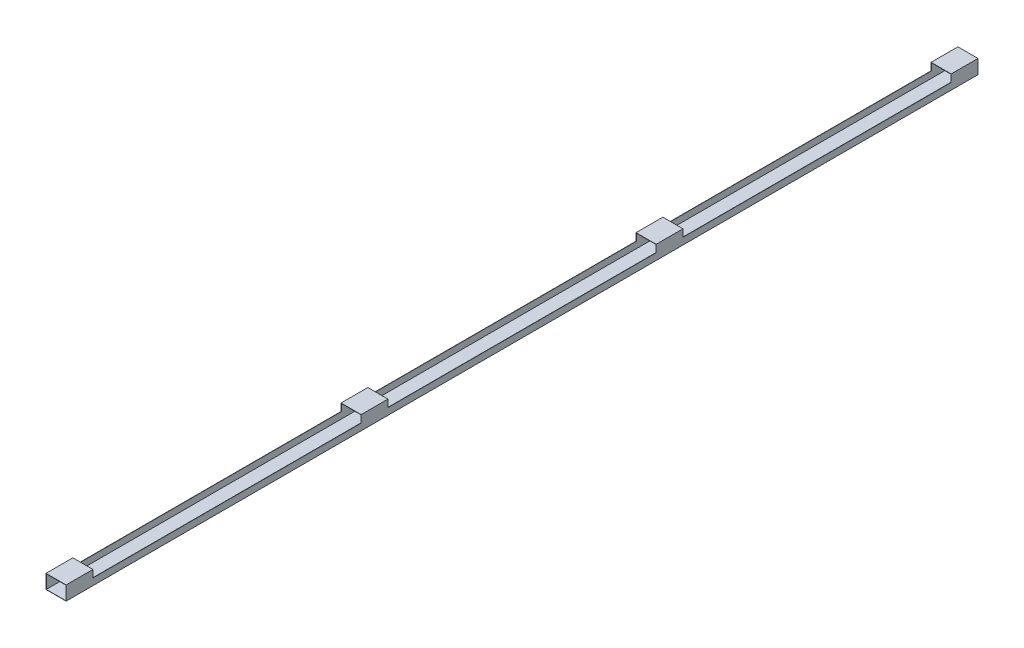
ISO-10303-21;
HEADER;
FILE_DESCRIPTION(('STEP AP214'),'2;1');
FILE_NAME('part.step','',(''),(''),'','','');
FILE_SCHEMA(('AUTOMOTIVE_DESIGN { 1 0 10303 214 1 1 1 1 }'));
ENDSEC;
DATA;
#1=APPLICATION_CONTEXT('core data for automotive mechanical design processes');
#2=APPLICATION_PROTOCOL_DEFINITION('international standard','automotive_design',2000,#1);
#3=PRODUCT_CONTEXT('',#1,'mechanical');
#4=PRODUCT('Part','Part','',(#3));
#5=PRODUCT_RELATED_PRODUCT_CATEGORY('part','',(#4));
#6=PRODUCT_DEFINITION_FORMATION('','',#4);
#7=PRODUCT_DEFINITION_CONTEXT('part definition',#1,'design');
#8=PRODUCT_DEFINITION('design','',#6,#7);
#9=PRODUCT_DEFINITION_SHAPE('','',#8);
#10=(LENGTH_UNIT() NAMED_UNIT(*) SI_UNIT(.MILLI.,.METRE.));
#11=(NAMED_UNIT(*) PLANE_ANGLE_UNIT() SI_UNIT($,.RADIAN.));
#12=(NAMED_UNIT(*) SI_UNIT($,.STERADIAN.) SOLID_ANGLE_UNIT());
#13=UNCERTAINTY_MEASURE_WITH_UNIT(LENGTH_MEASURE(1.E-05),#10,'distance_accuracy_value','');
#14=(GEOMETRIC_REPRESENTATION_CONTEXT(3) GLOBAL_UNCERTAINTY_ASSIGNED_CONTEXT((#13)) GLOBAL_UNIT_ASSIGNED_CONTEXT((#10,
#11,#12)) REPRESENTATION_CONTEXT('',''));
#15=CARTESIAN_POINT('',(0.,0.,0.));
#16=DIRECTION('',(0.,0.,1.));
#17=DIRECTION('',(1.,0.,0.));
#18=AXIS2_PLACEMENT_3D('',#15,#16,#17);
#19=CARTESIAN_POINT('',(-75.,25.,3400.));
#20=DIRECTION('',(0.,-1.,0.));
#21=DIRECTION('',(0.,0.,-1.));
#22=AXIS2_PLACEMENT_3D('',#19,#20,#21);
#23=PLANE('',#22);
#24=DIRECTION('',(0.,0.,-1.));
#25=VECTOR('',#24,1.);
#26=CARTESIAN_POINT('',(73.,25.,3400.));
#27=LINE('',#26,#25);
#28=CARTESIAN_POINT('',(73.,25.,3200.));
#29=VERTEX_POINT('',#28);
#30=CARTESIAN_POINT('',(73.,25.,1200.));
#31=VERTEX_POINT('',#30);
#32=EDGE_CURVE('E306',#29,#31,#27,.T.);
#33=ORIENTED_EDGE('',*,*,#32,.F.);
#34=DIRECTION('',(-1.,0.,0.));
#35=VECTOR('',#34,1.);
#36=CARTESIAN_POINT('',(-75.,25.,3200.));
#37=LINE('',#36,#35);
#38=CARTESIAN_POINT('',(75.,25.,3200.));
#39=VERTEX_POINT('',#38);
#40=EDGE_CURVE('E392',#39,#29,#37,.T.);
#41=ORIENTED_EDGE('',*,*,#40,.F.);
#42=DIRECTION('',(0.,0.,-1.));
#43=VECTOR('',#42,1.);
#44=CARTESIAN_POINT('',(75.,25.,3400.));
#45=LINE('',#44,#43);
#46=CARTESIAN_POINT('',(75.,25.,1200.));
#47=VERTEX_POINT('',#46);
#48=EDGE_CURVE('E11',#39,#47,#45,.T.);
#49=ORIENTED_EDGE('',*,*,#48,.T.);
#50=DIRECTION('',(1.,0.,0.));
#51=VECTOR('',#50,1.);
#52=CARTESIAN_POINT('',(-75.,25.,1200.));
#53=LINE('',#52,#51);
#54=EDGE_CURVE('E326',#31,#47,#53,.T.);
#55=ORIENTED_EDGE('',*,*,#54,.F.);
#56=EDGE_LOOP('',(#33,#41,#49,#55));
#57=FACE_BOUND('',#56,.T.);
#58=ADVANCED_FACE('F17',(#57),#23,.F.);
#59=DIRECTION('',(0.,0.,-1.));
#60=VECTOR('',#59,1.);
#61=CARTESIAN_POINT('',(73.,25.,3400.));
#62=LINE('',#61,#60);
#63=CARTESIAN_POINT('',(73.,25.,1000.));
#64=VERTEX_POINT('',#63);
#65=CARTESIAN_POINT('',(73.,25.,-1000.));
#66=VERTEX_POINT('',#65);
#67=EDGE_CURVE('E282',#64,#66,#62,.T.);
#68=ORIENTED_EDGE('',*,*,#67,.F.);
#69=DIRECTION('',(-1.,0.,0.));
#70=VECTOR('',#69,1.);
#71=CARTESIAN_POINT('',(-75.,25.,1000.));
#72=LINE('',#71,#70);
#73=CARTESIAN_POINT('',(75.,25.,1000.));
#74=VERTEX_POINT('',#73);
#75=EDGE_CURVE('E337',#74,#64,#72,.T.);
#76=ORIENTED_EDGE('',*,*,#75,.F.);
#77=CARTESIAN_POINT('',(75.,25.,-1000.));
#78=VERTEX_POINT('',#77);
#79=EDGE_CURVE('E27',#74,#78,#45,.T.);
#80=ORIENTED_EDGE('',*,*,#79,.T.);
#81=DIRECTION('',(1.,0.,0.));
#82=VECTOR('',#81,1.);
#83=CARTESIAN_POINT('',(-75.,25.,-1000.));
#84=LINE('',#83,#82);
#85=EDGE_CURVE('E359',#66,#78,#84,.T.);
#86=ORIENTED_EDGE('',*,*,#85,.F.);
#87=EDGE_LOOP('',(#68,#76,#80,#86));
#88=FACE_BOUND('',#87,.T.);
#89=ADVANCED_FACE('F460',(#88),#23,.F.);
#90=DIRECTION('',(0.,0.,-1.));
#91=VECTOR('',#90,1.);
#92=CARTESIAN_POINT('',(73.,25.,3400.));
#93=LINE('',#92,#91);
#94=CARTESIAN_POINT('',(73.,25.,-1200.));
#95=VERTEX_POINT('',#94);
#96=CARTESIAN_POINT('',(73.,25.,-3200.));
#97=VERTEX_POINT('',#96);
#98=EDGE_CURVE('E280',#95,#97,#93,.T.);
#99=ORIENTED_EDGE('',*,*,#98,.F.);
#100=DIRECTION('',(-1.,0.,0.));
#101=VECTOR('',#100,1.);
#102=CARTESIAN_POINT('',(-75.,25.,-1200.));
#103=LINE('',#102,#101);
#104=CARTESIAN_POINT('',(75.,25.,-1200.));
#105=VERTEX_POINT('',#104);
#106=EDGE_CURVE('E364',#105,#95,#103,.T.);
#107=ORIENTED_EDGE('',*,*,#106,.F.);
#108=CARTESIAN_POINT('',(75.,25.,-3200.));
#109=VERTEX_POINT('',#108);
#110=EDGE_CURVE('E441',#105,#109,#45,.T.);
#111=ORIENTED_EDGE('',*,*,#110,.T.);
#112=DIRECTION('',(1.,0.,0.));
#113=VECTOR('',#112,1.);
#114=CARTESIAN_POINT('',(-75.,25.,-3200.));
#115=LINE('',#114,#113);
#116=EDGE_CURVE('E21',#97,#109,#115,.T.);
#117=ORIENTED_EDGE('',*,*,#116,.F.);
#118=EDGE_LOOP('',(#99,#107,#111,#117));
#119=FACE_BOUND('',#118,.T.);
#120=ADVANCED_FACE('F504',(#119),#23,.F.);
#121=CARTESIAN_POINT('',(0.,0.,3400.));
#122=DIRECTION('',(0.,0.,-1.));
#123=DIRECTION('',(-1.,0.,0.));
#124=AXIS2_PLACEMENT_3D('',#121,#122,#123);
#125=PLANE('',#124);
#126=DIRECTION('',(0.,1.,0.));
#127=VECTOR('',#126,1.);
#128=CARTESIAN_POINT('',(75.,-25.,3400.));
#129=LINE('',#128,#127);
#130=CARTESIAN_POINT('',(75.,-25.,3400.));
#131=VERTEX_POINT('',#130);
#132=CARTESIAN_POINT('',(75.,80.,3400.));
#133=VERTEX_POINT('',#132);
#134=EDGE_CURVE('E420',#131,#133,#129,.T.);
#135=ORIENTED_EDGE('',*,*,#134,.T.);
#136=DIRECTION('',(1.,0.,0.));
#137=VECTOR('',#136,1.);
#138=CARTESIAN_POINT('',(-75.,80.,3400.));
#139=LINE('',#138,#137);
#140=CARTESIAN_POINT('',(-75.,80.,3400.));
#141=VERTEX_POINT('',#140);
#142=EDGE_CURVE('E391',#141,#133,#139,.T.);
#143=ORIENTED_EDGE('',*,*,#142,.F.);
#144=DIRECTION('',(0.,-1.,0.));
#145=VECTOR('',#144,1.);
#146=CARTESIAN_POINT('',(-75.,-25.,3400.));
#147=LINE('',#146,#145);
#148=CARTESIAN_POINT('',(-75.,-25.,3400.));
#149=VERTEX_POINT('',#148);
#150=EDGE_CURVE('E780',#141,#149,#147,.T.);
#151=ORIENTED_EDGE('',*,*,#150,.T.);
#152=DIRECTION('',(1.,0.,0.));
#153=VECTOR('',#152,1.);
#154=CARTESIAN_POINT('',(-75.,-25.,3400.));
#155=LINE('',#154,#153);
#156=EDGE_CURVE('E810',#149,#131,#155,.T.);
#157=ORIENTED_EDGE('',*,*,#156,.T.);
#158=EDGE_LOOP('',(#135,#143,#151,#157));
#159=FACE_BOUND('',#158,.T.);
#160=DIRECTION('',(0.,1.,0.));
#161=VECTOR('',#160,1.);
#162=CARTESIAN_POINT('',(73.,0.,3400.));
#163=LINE('',#162,#161);
#164=CARTESIAN_POINT('',(73.,-23.,3400.));
#165=VERTEX_POINT('',#164);
#166=CARTESIAN_POINT('',(73.,78.,3400.));
#167=VERTEX_POINT('',#166);
#168=EDGE_CURVE('E250',#165,#167,#163,.T.);
#169=ORIENTED_EDGE('',*,*,#168,.F.);
#170=DIRECTION('',(1.,0.,0.));
#171=VECTOR('',#170,1.);
#172=CARTESIAN_POINT('',(0.,-23.,3400.));
#173=LINE('',#172,#171);
#174=CARTESIAN_POINT('',(-73.,-23.,3400.));
#175=VERTEX_POINT('',#174);
#176=EDGE_CURVE('E235',#175,#165,#173,.T.);
#177=ORIENTED_EDGE('',*,*,#176,.F.);
#178=DIRECTION('',(0.,-1.,0.));
#179=VECTOR('',#178,1.);
#180=CARTESIAN_POINT('',(-73.,0.,3400.));
#181=LINE('',#180,#179);
#182=CARTESIAN_POINT('',(-73.,78.,3400.));
#183=VERTEX_POINT('',#182);
#184=EDGE_CURVE('E252',#183,#175,#181,.T.);
#185=ORIENTED_EDGE('',*,*,#184,.F.);
#186=DIRECTION('',(1.,0.,0.));
#187=VECTOR('',#186,1.);
#188=CARTESIAN_POINT('',(0.,78.,3400.));
#189=LINE('',#188,#187);
#190=EDGE_CURVE('E328',#183,#167,#189,.T.);
#191=ORIENTED_EDGE('',*,*,#190,.T.);
#192=EDGE_LOOP('',(#169,#177,#185,#191));
#193=FACE_BOUND('',#192,.T.);
#194=ADVANCED_FACE('F539',(#159,#193),#125,.F.);
#195=CARTESIAN_POINT('',(0.,0.,-3400.));
#196=DIRECTION('',(0.,0.,-1.));
#197=DIRECTION('',(-1.,0.,0.));
#198=AXIS2_PLACEMENT_3D('',#195,#196,#197);
#199=PLANE('',#198);
#200=DIRECTION('',(0.,1.,0.));
#201=VECTOR('',#200,1.);
#202=CARTESIAN_POINT('',(75.,-25.,-3400.));
#203=LINE('',#202,#201);
#204=CARTESIAN_POINT('',(75.,-25.,-3400.));
#205=VERTEX_POINT('',#204);
#206=CARTESIAN_POINT('',(75.,80.,-3400.));
#207=VERTEX_POINT('',#206);
#208=EDGE_CURVE('E436',#205,#207,#203,.T.);
#209=ORIENTED_EDGE('',*,*,#208,.F.);
#210=DIRECTION('',(1.,0.,0.));
#211=VECTOR('',#210,1.);
#212=CARTESIAN_POINT('',(-75.,-25.,-3400.));
#213=LINE('',#212,#211);
#214=CARTESIAN_POINT('',(-75.,-25.,-3400.));
#215=VERTEX_POINT('',#214);
#216=EDGE_CURVE('E803',#215,#205,#213,.T.);
#217=ORIENTED_EDGE('',*,*,#216,.F.);
#218=DIRECTION('',(0.,-1.,0.));
#219=VECTOR('',#218,1.);
#220=CARTESIAN_POINT('',(-75.,-25.,-3400.));
#221=LINE('',#220,#219);
#222=CARTESIAN_POINT('',(-75.,80.,-3400.));
#223=VERTEX_POINT('',#222);
#224=EDGE_CURVE('E802',#223,#215,#221,.T.);
#225=ORIENTED_EDGE('',*,*,#224,.F.);
#226=DIRECTION('',(-1.,0.,0.));
#227=VECTOR('',#226,1.);
#228=CARTESIAN_POINT('',(-75.,80.,-3400.));
#229=LINE('',#228,#227);
#230=EDGE_CURVE('E415',#207,#223,#229,.T.);
#231=ORIENTED_EDGE('',*,*,#230,.F.);
#232=EDGE_LOOP('',(#209,#217,#225,#231));
#233=FACE_BOUND('',#232,.T.);
#234=DIRECTION('',(1.,0.,0.));
#235=VECTOR('',#234,1.);
#236=CARTESIAN_POINT('',(0.,-23.,-3400.));
#237=LINE('',#236,#235);
#238=CARTESIAN_POINT('',(-73.,-23.,-3400.));
#239=VERTEX_POINT('',#238);
#240=CARTESIAN_POINT('',(73.,-23.,-3400.));
#241=VERTEX_POINT('',#240);
#242=EDGE_CURVE('E232',#239,#241,#237,.T.);
#243=ORIENTED_EDGE('',*,*,#242,.T.);
#244=DIRECTION('',(0.,1.,0.));
#245=VECTOR('',#244,1.);
#246=CARTESIAN_POINT('',(73.,0.,-3400.));
#247=LINE('',#246,#245);
#248=CARTESIAN_POINT('',(73.,78.,-3400.));
#249=VERTEX_POINT('',#248);
#250=EDGE_CURVE('E240',#241,#249,#247,.T.);
#251=ORIENTED_EDGE('',*,*,#250,.T.);
#252=DIRECTION('',(-1.,0.,0.));
#253=VECTOR('',#252,1.);
#254=CARTESIAN_POINT('',(0.,78.,-3400.));
#255=LINE('',#254,#253);
#256=CARTESIAN_POINT('',(-73.,78.,-3400.));
#257=VERTEX_POINT('',#256);
#258=EDGE_CURVE('E257',#249,#257,#255,.T.);
#259=ORIENTED_EDGE('',*,*,#258,.T.);
#260=DIRECTION('',(0.,-1.,0.));
#261=VECTOR('',#260,1.);
#262=CARTESIAN_POINT('',(-73.,0.,-3400.));
#263=LINE('',#262,#261);
#264=EDGE_CURVE('E246',#257,#239,#263,.T.);
#265=ORIENTED_EDGE('',*,*,#264,.T.);
#266=EDGE_LOOP('',(#243,#251,#259,#265));
#267=FACE_BOUND('',#266,.T.);
#268=ADVANCED_FACE('F249',(#233,#267),#199,.T.);
#269=CARTESIAN_POINT('',(-73.,25.,3200.));
#270=VERTEX_POINT('',#269);
#271=CARTESIAN_POINT('',(-75.,25.,3200.));
#272=VERTEX_POINT('',#271);
#273=EDGE_CURVE('E387',#270,#272,#37,.T.);
#274=ORIENTED_EDGE('',*,*,#273,.F.);
#275=DIRECTION('',(0.,0.,-1.));
#276=VECTOR('',#275,1.);
#277=CARTESIAN_POINT('',(-73.,25.,3400.));
#278=LINE('',#277,#276);
#279=CARTESIAN_POINT('',(-73.,25.,1200.));
#280=VERTEX_POINT('',#279);
#281=EDGE_CURVE('E283',#270,#280,#278,.T.);
#282=ORIENTED_EDGE('',*,*,#281,.T.);
#283=CARTESIAN_POINT('',(-75.,25.,1200.));
#284=VERTEX_POINT('',#283);
#285=EDGE_CURVE('E344',#284,#280,#53,.T.);
#286=ORIENTED_EDGE('',*,*,#285,.F.);
#287=DIRECTION('',(0.,0.,-1.));
#288=VECTOR('',#287,1.);
#289=CARTESIAN_POINT('',(-75.,25.,3400.));
#290=LINE('',#289,#288);
#291=EDGE_CURVE('E439',#272,#284,#290,.T.);
#292=ORIENTED_EDGE('',*,*,#291,.F.);
#293=EDGE_LOOP('',(#274,#282,#286,#292));
#294=FACE_BOUND('',#293,.T.);
#295=ADVANCED_FACE('F523',(#294),#23,.F.);
#296=CARTESIAN_POINT('',(-73.,25.,1000.));
#297=VERTEX_POINT('',#296);
#298=CARTESIAN_POINT('',(-75.,25.,1000.));
#299=VERTEX_POINT('',#298);
#300=EDGE_CURVE('E347',#297,#299,#72,.T.);
#301=ORIENTED_EDGE('',*,*,#300,.F.);
#302=DIRECTION('',(0.,0.,-1.));
#303=VECTOR('',#302,1.);
#304=CARTESIAN_POINT('',(-73.,25.,3400.));
#305=LINE('',#304,#303);
#306=CARTESIAN_POINT('',(-73.,25.,-1000.));
#307=VERTEX_POINT('',#306);
#308=EDGE_CURVE('E269',#297,#307,#305,.T.);
#309=ORIENTED_EDGE('',*,*,#308,.T.);
#310=CARTESIAN_POINT('',(-75.,25.,-1000.));
#311=VERTEX_POINT('',#310);
#312=EDGE_CURVE('E371',#311,#307,#84,.T.);
#313=ORIENTED_EDGE('',*,*,#312,.F.);
#314=EDGE_CURVE('E442',#299,#311,#290,.T.);
#315=ORIENTED_EDGE('',*,*,#314,.F.);
#316=EDGE_LOOP('',(#301,#309,#313,#315));
#317=FACE_BOUND('',#316,.T.);
#318=ADVANCED_FACE('F531',(#317),#23,.F.);
#319=CARTESIAN_POINT('',(-73.,25.,-1200.));
#320=VERTEX_POINT('',#319);
#321=CARTESIAN_POINT('',(-75.,25.,-1200.));
#322=VERTEX_POINT('',#321);
#323=EDGE_CURVE('E374',#320,#322,#103,.T.);
#324=ORIENTED_EDGE('',*,*,#323,.F.);
#325=DIRECTION('',(0.,0.,-1.));
#326=VECTOR('',#325,1.);
#327=CARTESIAN_POINT('',(-73.,25.,3400.));
#328=LINE('',#327,#326);
#329=CARTESIAN_POINT('',(-73.,25.,-3200.));
#330=VERTEX_POINT('',#329);
#331=EDGE_CURVE('E266',#320,#330,#328,.T.);
#332=ORIENTED_EDGE('',*,*,#331,.T.);
#333=CARTESIAN_POINT('',(-75.,25.,-3200.));
#334=VERTEX_POINT('',#333);
#335=EDGE_CURVE('E410',#334,#330,#115,.T.);
#336=ORIENTED_EDGE('',*,*,#335,.F.);
#337=EDGE_CURVE('E451',#322,#334,#290,.T.);
#338=ORIENTED_EDGE('',*,*,#337,.F.);
#339=EDGE_LOOP('',(#324,#332,#336,#338));
#340=FACE_BOUND('',#339,.T.);
#341=ADVANCED_FACE('F496',(#340),#23,.F.);
#342=CARTESIAN_POINT('',(75.,-25.,3400.));
#343=DIRECTION('',(-1.,0.,0.));
#344=DIRECTION('',(0.,0.,1.));
#345=AXIS2_PLACEMENT_3D('',#342,#343,#344);
#346=PLANE('',#345);
#347=ORIENTED_EDGE('',*,*,#208,.T.);
#348=DIRECTION('',(0.,0.,-1.));
#349=VECTOR('',#348,1.);
#350=CARTESIAN_POINT('',(75.,80.,-3400.));
#351=LINE('',#350,#349);
#352=CARTESIAN_POINT('',(75.,80.,-3200.));
#353=VERTEX_POINT('',#352);
#354=EDGE_CURVE('E412',#353,#207,#351,.T.);
#355=ORIENTED_EDGE('',*,*,#354,.F.);
#356=DIRECTION('',(0.,-1.,0.));
#357=VECTOR('',#356,1.);
#358=CARTESIAN_POINT('',(75.,80.,-3200.));
#359=LINE('',#358,#357);
#360=EDGE_CURVE('E417',#353,#109,#359,.T.);
#361=ORIENTED_EDGE('',*,*,#360,.T.);
#362=ORIENTED_EDGE('',*,*,#110,.F.);
#363=DIRECTION('',(0.,-1.,0.));
#364=VECTOR('',#363,1.);
#365=CARTESIAN_POINT('',(75.,80.,-1200.));
#366=LINE('',#365,#364);
#367=CARTESIAN_POINT('',(75.,80.,-1200.));
#368=VERTEX_POINT('',#367);
#369=EDGE_CURVE('E379',#368,#105,#366,.T.);
#370=ORIENTED_EDGE('',*,*,#369,.F.);
#371=DIRECTION('',(0.,0.,-1.));
#372=VECTOR('',#371,1.);
#373=CARTESIAN_POINT('',(75.,80.,-1200.));
#374=LINE('',#373,#372);
#375=CARTESIAN_POINT('',(75.,80.,-1000.));
#376=VERTEX_POINT('',#375);
#377=EDGE_CURVE('E366',#376,#368,#374,.T.);
#378=ORIENTED_EDGE('',*,*,#377,.F.);
#379=DIRECTION('',(0.,-1.,0.));
#380=VECTOR('',#379,1.);
#381=CARTESIAN_POINT('',(75.,80.,-1000.));
#382=LINE('',#381,#380);
#383=EDGE_CURVE('E381',#376,#78,#382,.T.);
#384=ORIENTED_EDGE('',*,*,#383,.T.);
#385=ORIENTED_EDGE('',*,*,#79,.F.);
#386=DIRECTION('',(0.,-1.,0.));
#387=VECTOR('',#386,1.);
#388=CARTESIAN_POINT('',(75.,80.,1000.));
#389=LINE('',#388,#387);
#390=CARTESIAN_POINT('',(75.,80.,1000.));
#391=VERTEX_POINT('',#390);
#392=EDGE_CURVE('E352',#391,#74,#389,.T.);
#393=ORIENTED_EDGE('',*,*,#392,.F.);
#394=DIRECTION('',(0.,0.,-1.));
#395=VECTOR('',#394,1.);
#396=CARTESIAN_POINT('',(75.,80.,1000.));
#397=LINE('',#396,#395);
#398=CARTESIAN_POINT('',(75.,80.,1200.));
#399=VERTEX_POINT('',#398);
#400=EDGE_CURVE('E339',#399,#391,#397,.T.);
#401=ORIENTED_EDGE('',*,*,#400,.F.);
#402=DIRECTION('',(0.,-1.,0.));
#403=VECTOR('',#402,1.);
#404=CARTESIAN_POINT('',(75.,80.,1200.));
#405=LINE('',#404,#403);
#406=EDGE_CURVE('E354',#399,#47,#405,.T.);
#407=ORIENTED_EDGE('',*,*,#406,.T.);
#408=ORIENTED_EDGE('',*,*,#48,.F.);
#409=DIRECTION('',(0.,-1.,0.));
#410=VECTOR('',#409,1.);
#411=CARTESIAN_POINT('',(75.,80.,3200.));
#412=LINE('',#411,#410);
#413=CARTESIAN_POINT('',(75.,80.,3200.));
#414=VERTEX_POINT('',#413);
#415=EDGE_CURVE('E404',#414,#39,#412,.T.);
#416=ORIENTED_EDGE('',*,*,#415,.F.);
#417=DIRECTION('',(0.,0.,-1.));
#418=VECTOR('',#417,1.);
#419=CARTESIAN_POINT('',(75.,80.,3400.));
#420=LINE('',#419,#418);
#421=EDGE_CURVE('E395',#133,#414,#420,.T.);
#422=ORIENTED_EDGE('',*,*,#421,.F.);
#423=ORIENTED_EDGE('',*,*,#134,.F.);
#424=DIRECTION('',(0.,0.,-1.));
#425=VECTOR('',#424,1.);
#426=CARTESIAN_POINT('',(75.,-25.,3400.));
#427=LINE('',#426,#425);
#428=EDGE_CURVE('E809',#131,#205,#427,.T.);
#429=ORIENTED_EDGE('',*,*,#428,.T.);
#430=EDGE_LOOP('',(#347,#355,#361,#362,#370,#378,#384,#385,#393,#401,#407,#408,#416,#422,#423,#429));
#431=FACE_BOUND('',#430,.T.);
#432=ADVANCED_FACE('F19',(#431),#346,.F.);
#433=CARTESIAN_POINT('',(-75.,-25.,3400.));
#434=DIRECTION('',(1.,0.,0.));
#435=DIRECTION('',(0.,0.,-1.));
#436=AXIS2_PLACEMENT_3D('',#433,#434,#435);
#437=PLANE('',#436);
#438=ORIENTED_EDGE('',*,*,#224,.T.);
#439=DIRECTION('',(0.,0.,-1.));
#440=VECTOR('',#439,1.);
#441=CARTESIAN_POINT('',(-75.,-25.,3400.));
#442=LINE('',#441,#440);
#443=EDGE_CURVE('E446',#149,#215,#442,.T.);
#444=ORIENTED_EDGE('',*,*,#443,.F.);
#445=ORIENTED_EDGE('',*,*,#150,.F.);
#446=DIRECTION('',(0.,0.,1.));
#447=VECTOR('',#446,1.);
#448=CARTESIAN_POINT('',(-75.,80.,3400.));
#449=LINE('',#448,#447);
#450=CARTESIAN_POINT('',(-75.,80.,3200.));
#451=VERTEX_POINT('',#450);
#452=EDGE_CURVE('E388',#451,#141,#449,.T.);
#453=ORIENTED_EDGE('',*,*,#452,.F.);
#454=DIRECTION('',(0.,-1.,0.));
#455=VECTOR('',#454,1.);
#456=CARTESIAN_POINT('',(-75.,80.,3200.));
#457=LINE('',#456,#455);
#458=EDGE_CURVE('E399',#451,#272,#457,.T.);
#459=ORIENTED_EDGE('',*,*,#458,.T.);
#460=ORIENTED_EDGE('',*,*,#291,.T.);
#461=DIRECTION('',(0.,-1.,0.));
#462=VECTOR('',#461,1.);
#463=CARTESIAN_POINT('',(-75.,80.,1200.));
#464=LINE('',#463,#462);
#465=CARTESIAN_POINT('',(-75.,80.,1200.));
#466=VERTEX_POINT('',#465);
#467=EDGE_CURVE('E357',#466,#284,#464,.T.);
#468=ORIENTED_EDGE('',*,*,#467,.F.);
#469=DIRECTION('',(0.,0.,1.));
#470=VECTOR('',#469,1.);
#471=CARTESIAN_POINT('',(-75.,80.,1000.));
#472=LINE('',#471,#470);
#473=CARTESIAN_POINT('',(-75.,80.,1000.));
#474=VERTEX_POINT('',#473);
#475=EDGE_CURVE('E333',#474,#466,#472,.T.);
#476=ORIENTED_EDGE('',*,*,#475,.F.);
#477=DIRECTION('',(0.,-1.,0.));
#478=VECTOR('',#477,1.);
#479=CARTESIAN_POINT('',(-75.,80.,1000.));
#480=LINE('',#479,#478);
#481=EDGE_CURVE('E343',#474,#299,#480,.T.);
#482=ORIENTED_EDGE('',*,*,#481,.T.);
#483=ORIENTED_EDGE('',*,*,#314,.T.);
#484=DIRECTION('',(0.,-1.,0.));
#485=VECTOR('',#484,1.);
#486=CARTESIAN_POINT('',(-75.,80.,-1000.));
#487=LINE('',#486,#485);
#488=CARTESIAN_POINT('',(-75.,80.,-1000.));
#489=VERTEX_POINT('',#488);
#490=EDGE_CURVE('E384',#489,#311,#487,.T.);
#491=ORIENTED_EDGE('',*,*,#490,.F.);
#492=DIRECTION('',(0.,0.,1.));
#493=VECTOR('',#492,1.);
#494=CARTESIAN_POINT('',(-75.,80.,-1200.));
#495=LINE('',#494,#493);
#496=CARTESIAN_POINT('',(-75.,80.,-1200.));
#497=VERTEX_POINT('',#496);
#498=EDGE_CURVE('E360',#497,#489,#495,.T.);
#499=ORIENTED_EDGE('',*,*,#498,.F.);
#500=DIRECTION('',(0.,-1.,0.));
#501=VECTOR('',#500,1.);
#502=CARTESIAN_POINT('',(-75.,80.,-1200.));
#503=LINE('',#502,#501);
#504=EDGE_CURVE('E370',#497,#322,#503,.T.);
#505=ORIENTED_EDGE('',*,*,#504,.T.);
#506=ORIENTED_EDGE('',*,*,#337,.T.);
#507=DIRECTION('',(0.,-1.,0.));
#508=VECTOR('',#507,1.);
#509=CARTESIAN_POINT('',(-75.,80.,-3200.));
#510=LINE('',#509,#508);
#511=CARTESIAN_POINT('',(-75.,80.,-3200.));
#512=VERTEX_POINT('',#511);
#513=EDGE_CURVE('E431',#512,#334,#510,.T.);
#514=ORIENTED_EDGE('',*,*,#513,.F.);
#515=DIRECTION('',(0.,0.,1.));
#516=VECTOR('',#515,1.);
#517=CARTESIAN_POINT('',(-75.,80.,-3400.));
#518=LINE('',#517,#516);
#519=EDGE_CURVE('E406',#223,#512,#518,.T.);
#520=ORIENTED_EDGE('',*,*,#519,.F.);
#521=EDGE_LOOP('',(#438,#444,#445,#453,#459,#460,#468,#476,#482,#483,#491,#499,#505,#506,#514,#520));
#522=FACE_BOUND('',#521,.T.);
#523=ADVANCED_FACE('F548',(#522),#437,.F.);
#524=CARTESIAN_POINT('',(-75.,-25.,3400.));
#525=DIRECTION('',(0.,1.,0.));
#526=DIRECTION('',(0.,0.,1.));
#527=AXIS2_PLACEMENT_3D('',#524,#525,#526);
#528=PLANE('',#527);
#529=ORIENTED_EDGE('',*,*,#216,.T.);
#530=ORIENTED_EDGE('',*,*,#428,.F.);
#531=ORIENTED_EDGE('',*,*,#156,.F.);
#532=ORIENTED_EDGE('',*,*,#443,.T.);
#533=EDGE_LOOP('',(#529,#530,#531,#532));
#534=FACE_BOUND('',#533,.T.);
#535=ADVANCED_FACE('F553',(#534),#528,.F.);
#536=CARTESIAN_POINT('',(-75.,80.,-3200.));
#537=DIRECTION('',(0.,0.,-1.));
#538=DIRECTION('',(-1.,0.,0.));
#539=AXIS2_PLACEMENT_3D('',#536,#537,#538);
#540=PLANE('',#539);
#541=DIRECTION('',(1.,0.,0.));
#542=VECTOR('',#541,1.);
#543=CARTESIAN_POINT('',(-75.,78.,-3200.));
#544=LINE('',#543,#542);
#545=CARTESIAN_POINT('',(-73.,78.,-3200.));
#546=VERTEX_POINT('',#545);
#547=CARTESIAN_POINT('',(73.,78.,-3200.));
#548=VERTEX_POINT('',#547);
#549=EDGE_CURVE('E262',#546,#548,#544,.T.);
#550=ORIENTED_EDGE('',*,*,#549,.T.);
#551=DIRECTION('',(0.,-1.,0.));
#552=VECTOR('',#551,1.);
#553=CARTESIAN_POINT('',(73.,-25.,-3200.));
#554=LINE('',#553,#552);
#555=EDGE_CURVE('E259',#548,#97,#554,.T.);
#556=ORIENTED_EDGE('',*,*,#555,.T.);
#557=ORIENTED_EDGE('',*,*,#116,.T.);
#558=ORIENTED_EDGE('',*,*,#360,.F.);
#559=DIRECTION('',(1.,0.,0.));
#560=VECTOR('',#559,1.);
#561=CARTESIAN_POINT('',(-75.,80.,-3200.));
#562=LINE('',#561,#560);
#563=EDGE_CURVE('E409',#512,#353,#562,.T.);
#564=ORIENTED_EDGE('',*,*,#563,.F.);
#565=ORIENTED_EDGE('',*,*,#513,.T.);
#566=ORIENTED_EDGE('',*,*,#335,.T.);
#567=DIRECTION('',(0.,-1.,0.));
#568=VECTOR('',#567,1.);
#569=CARTESIAN_POINT('',(-73.,80.,-3200.));
#570=LINE('',#569,#568);
#571=EDGE_CURVE('E247',#546,#330,#570,.T.);
#572=ORIENTED_EDGE('',*,*,#571,.F.);
#573=EDGE_LOOP('',(#550,#556,#557,#558,#564,#565,#566,#572));
#574=FACE_BOUND('',#573,.T.);
#575=ADVANCED_FACE('F490',(#574),#540,.F.);
#576=CARTESIAN_POINT('',(0.,80.,0.));
#577=DIRECTION('',(0.,1.,0.));
#578=DIRECTION('',(0.,0.,1.));
#579=AXIS2_PLACEMENT_3D('',#576,#577,#578);
#580=PLANE('',#579);
#581=ORIENTED_EDGE('',*,*,#519,.T.);
#582=ORIENTED_EDGE('',*,*,#563,.T.);
#583=ORIENTED_EDGE('',*,*,#354,.T.);
#584=ORIENTED_EDGE('',*,*,#230,.T.);
#585=EDGE_LOOP('',(#581,#582,#583,#584));
#586=FACE_BOUND('',#585,.T.);
#587=ADVANCED_FACE('F567',(#586),#580,.T.);
#588=CARTESIAN_POINT('',(-75.,80.,3200.));
#589=DIRECTION('',(0.,0.,1.));
#590=DIRECTION('',(1.,0.,0.));
#591=AXIS2_PLACEMENT_3D('',#588,#589,#590);
#592=PLANE('',#591);
#593=DIRECTION('',(-1.,0.,0.));
#594=VECTOR('',#593,1.);
#595=CARTESIAN_POINT('',(0.,78.,3200.));
#596=LINE('',#595,#594);
#597=CARTESIAN_POINT('',(73.,78.,3200.));
#598=VERTEX_POINT('',#597);
#599=CARTESIAN_POINT('',(-73.,78.,3200.));
#600=VERTEX_POINT('',#599);
#601=EDGE_CURVE('E321',#598,#600,#596,.T.);
#602=ORIENTED_EDGE('',*,*,#601,.T.);
#603=DIRECTION('',(0.,-1.,0.));
#604=VECTOR('',#603,1.);
#605=CARTESIAN_POINT('',(-73.,-25.,3200.));
#606=LINE('',#605,#604);
#607=EDGE_CURVE('E317',#600,#270,#606,.T.);
#608=ORIENTED_EDGE('',*,*,#607,.T.);
#609=ORIENTED_EDGE('',*,*,#273,.T.);
#610=ORIENTED_EDGE('',*,*,#458,.F.);
#611=DIRECTION('',(-1.,0.,0.));
#612=VECTOR('',#611,1.);
#613=CARTESIAN_POINT('',(-75.,80.,3200.));
#614=LINE('',#613,#612);
#615=EDGE_CURVE('E397',#414,#451,#614,.T.);
#616=ORIENTED_EDGE('',*,*,#615,.F.);
#617=ORIENTED_EDGE('',*,*,#415,.T.);
#618=ORIENTED_EDGE('',*,*,#40,.T.);
#619=DIRECTION('',(0.,-1.,0.));
#620=VECTOR('',#619,1.);
#621=CARTESIAN_POINT('',(73.,80.,3200.));
#622=LINE('',#621,#620);
#623=EDGE_CURVE('E320',#598,#29,#622,.T.);
#624=ORIENTED_EDGE('',*,*,#623,.F.);
#625=EDGE_LOOP('',(#602,#608,#609,#610,#616,#617,#618,#624));
#626=FACE_BOUND('',#625,.T.);
#627=ADVANCED_FACE('F570',(#626),#592,.F.);
#628=CARTESIAN_POINT('',(0.,80.,0.));
#629=DIRECTION('',(0.,-1.,0.));
#630=DIRECTION('',(0.,0.,-1.));
#631=AXIS2_PLACEMENT_3D('',#628,#629,#630);
#632=PLANE('',#631);
#633=ORIENTED_EDGE('',*,*,#452,.T.);
#634=ORIENTED_EDGE('',*,*,#142,.T.);
#635=ORIENTED_EDGE('',*,*,#421,.T.);
#636=ORIENTED_EDGE('',*,*,#615,.T.);
#637=EDGE_LOOP('',(#633,#634,#635,#636));
#638=FACE_BOUND('',#637,.T.);
#639=ADVANCED_FACE('F574',(#638),#632,.F.);
#640=CARTESIAN_POINT('',(-75.,80.,-1000.));
#641=DIRECTION('',(0.,0.,-1.));
#642=DIRECTION('',(-1.,0.,0.));
#643=AXIS2_PLACEMENT_3D('',#640,#641,#642);
#644=PLANE('',#643);
#645=DIRECTION('',(1.,0.,0.));
#646=VECTOR('',#645,1.);
#647=CARTESIAN_POINT('',(-75.,78.,-1000.));
#648=LINE('',#647,#646);
#649=CARTESIAN_POINT('',(-73.,78.,-1000.));
#650=VERTEX_POINT('',#649);
#651=CARTESIAN_POINT('',(73.,78.,-1000.));
#652=VERTEX_POINT('',#651);
#653=EDGE_CURVE('E287',#650,#652,#648,.T.);
#654=ORIENTED_EDGE('',*,*,#653,.T.);
#655=DIRECTION('',(0.,-1.,0.));
#656=VECTOR('',#655,1.);
#657=CARTESIAN_POINT('',(73.,-25.,-1000.));
#658=LINE('',#657,#656);
#659=EDGE_CURVE('E279',#652,#66,#658,.T.);
#660=ORIENTED_EDGE('',*,*,#659,.T.);
#661=ORIENTED_EDGE('',*,*,#85,.T.);
#662=ORIENTED_EDGE('',*,*,#383,.F.);
#663=DIRECTION('',(1.,0.,0.));
#664=VECTOR('',#663,1.);
#665=CARTESIAN_POINT('',(-75.,80.,-1000.));
#666=LINE('',#665,#664);
#667=EDGE_CURVE('E363',#489,#376,#666,.T.);
#668=ORIENTED_EDGE('',*,*,#667,.F.);
#669=ORIENTED_EDGE('',*,*,#490,.T.);
#670=ORIENTED_EDGE('',*,*,#312,.T.);
#671=DIRECTION('',(0.,-1.,0.));
#672=VECTOR('',#671,1.);
#673=CARTESIAN_POINT('',(-73.,80.,-1000.));
#674=LINE('',#673,#672);
#675=EDGE_CURVE('E286',#650,#307,#674,.T.);
#676=ORIENTED_EDGE('',*,*,#675,.F.);
#677=EDGE_LOOP('',(#654,#660,#661,#662,#668,#669,#670,#676));
#678=FACE_BOUND('',#677,.T.);
#679=ADVANCED_FACE('F467',(#678),#644,.F.);
#680=CARTESIAN_POINT('',(-75.,80.,-1200.));
#681=DIRECTION('',(0.,0.,1.));
#682=DIRECTION('',(1.,0.,0.));
#683=AXIS2_PLACEMENT_3D('',#680,#681,#682);
#684=PLANE('',#683);
#685=DIRECTION('',(-1.,0.,0.));
#686=VECTOR('',#685,1.);
#687=CARTESIAN_POINT('',(-75.,78.,-1200.));
#688=LINE('',#687,#686);
#689=CARTESIAN_POINT('',(73.,78.,-1200.));
#690=VERTEX_POINT('',#689);
#691=CARTESIAN_POINT('',(-73.,78.,-1200.));
#692=VERTEX_POINT('',#691);
#693=EDGE_CURVE('E274',#690,#692,#688,.T.);
#694=ORIENTED_EDGE('',*,*,#693,.T.);
#695=DIRECTION('',(0.,-1.,0.));
#696=VECTOR('',#695,1.);
#697=CARTESIAN_POINT('',(-73.,-25.,-1200.));
#698=LINE('',#697,#696);
#699=EDGE_CURVE('E270',#692,#320,#698,.T.);
#700=ORIENTED_EDGE('',*,*,#699,.T.);
#701=ORIENTED_EDGE('',*,*,#323,.T.);
#702=ORIENTED_EDGE('',*,*,#504,.F.);
#703=DIRECTION('',(-1.,0.,0.));
#704=VECTOR('',#703,1.);
#705=CARTESIAN_POINT('',(-75.,80.,-1200.));
#706=LINE('',#705,#704);
#707=EDGE_CURVE('E368',#368,#497,#706,.T.);
#708=ORIENTED_EDGE('',*,*,#707,.F.);
#709=ORIENTED_EDGE('',*,*,#369,.T.);
#710=ORIENTED_EDGE('',*,*,#106,.T.);
#711=DIRECTION('',(0.,-1.,0.));
#712=VECTOR('',#711,1.);
#713=CARTESIAN_POINT('',(73.,80.,-1200.));
#714=LINE('',#713,#712);
#715=EDGE_CURVE('E273',#690,#95,#714,.T.);
#716=ORIENTED_EDGE('',*,*,#715,.F.);
#717=EDGE_LOOP('',(#694,#700,#701,#702,#708,#709,#710,#716));
#718=FACE_BOUND('',#717,.T.);
#719=ADVANCED_FACE('F498',(#718),#684,.F.);
#720=CARTESIAN_POINT('',(0.,80.,0.));
#721=DIRECTION('',(0.,1.,0.));
#722=DIRECTION('',(0.,0.,1.));
#723=AXIS2_PLACEMENT_3D('',#720,#721,#722);
#724=PLANE('',#723);
#725=ORIENTED_EDGE('',*,*,#498,.T.);
#726=ORIENTED_EDGE('',*,*,#667,.T.);
#727=ORIENTED_EDGE('',*,*,#377,.T.);
#728=ORIENTED_EDGE('',*,*,#707,.T.);
#729=EDGE_LOOP('',(#725,#726,#727,#728));
#730=FACE_BOUND('',#729,.T.);
#731=ADVANCED_FACE('F583',(#730),#724,.T.);
#732=CARTESIAN_POINT('',(-75.,80.,1200.));
#733=DIRECTION('',(0.,0.,-1.));
#734=DIRECTION('',(-1.,0.,0.));
#735=AXIS2_PLACEMENT_3D('',#732,#733,#734);
#736=PLANE('',#735);
#737=DIRECTION('',(1.,0.,0.));
#738=VECTOR('',#737,1.);
#739=CARTESIAN_POINT('',(-75.,78.,1200.));
#740=LINE('',#739,#738);
#741=CARTESIAN_POINT('',(-73.,78.,1200.));
#742=VERTEX_POINT('',#741);
#743=CARTESIAN_POINT('',(73.,78.,1200.));
#744=VERTEX_POINT('',#743);
#745=EDGE_CURVE('E310',#742,#744,#740,.T.);
#746=ORIENTED_EDGE('',*,*,#745,.T.);
#747=DIRECTION('',(0.,-1.,0.));
#748=VECTOR('',#747,1.);
#749=CARTESIAN_POINT('',(73.,-25.,1200.));
#750=LINE('',#749,#748);
#751=EDGE_CURVE('E304',#744,#31,#750,.T.);
#752=ORIENTED_EDGE('',*,*,#751,.T.);
#753=ORIENTED_EDGE('',*,*,#54,.T.);
#754=ORIENTED_EDGE('',*,*,#406,.F.);
#755=DIRECTION('',(1.,0.,0.));
#756=VECTOR('',#755,1.);
#757=CARTESIAN_POINT('',(-75.,80.,1200.));
#758=LINE('',#757,#756);
#759=EDGE_CURVE('E336',#466,#399,#758,.T.);
#760=ORIENTED_EDGE('',*,*,#759,.F.);
#761=ORIENTED_EDGE('',*,*,#467,.T.);
#762=ORIENTED_EDGE('',*,*,#285,.T.);
#763=DIRECTION('',(0.,-1.,0.));
#764=VECTOR('',#763,1.);
#765=CARTESIAN_POINT('',(-73.,80.,1200.));
#766=LINE('',#765,#764);
#767=EDGE_CURVE('E309',#742,#280,#766,.T.);
#768=ORIENTED_EDGE('',*,*,#767,.F.);
#769=EDGE_LOOP('',(#746,#752,#753,#754,#760,#761,#762,#768));
#770=FACE_BOUND('',#769,.T.);
#771=ADVANCED_FACE('F586',(#770),#736,.F.);
#772=CARTESIAN_POINT('',(-75.,80.,1000.));
#773=DIRECTION('',(0.,0.,1.));
#774=DIRECTION('',(1.,0.,0.));
#775=AXIS2_PLACEMENT_3D('',#772,#773,#774);
#776=PLANE('',#775);
#777=DIRECTION('',(-1.,0.,0.));
#778=VECTOR('',#777,1.);
#779=CARTESIAN_POINT('',(-75.,78.,1000.));
#780=LINE('',#779,#778);
#781=CARTESIAN_POINT('',(73.,78.,1000.));
#782=VERTEX_POINT('',#781);
#783=CARTESIAN_POINT('',(-73.,78.,1000.));
#784=VERTEX_POINT('',#783);
#785=EDGE_CURVE('E299',#782,#784,#780,.T.);
#786=ORIENTED_EDGE('',*,*,#785,.T.);
#787=DIRECTION('',(0.,-1.,0.));
#788=VECTOR('',#787,1.);
#789=CARTESIAN_POINT('',(-73.,-25.,1000.));
#790=LINE('',#789,#788);
#791=EDGE_CURVE('E295',#784,#297,#790,.T.);
#792=ORIENTED_EDGE('',*,*,#791,.T.);
#793=ORIENTED_EDGE('',*,*,#300,.T.);
#794=ORIENTED_EDGE('',*,*,#481,.F.);
#795=DIRECTION('',(-1.,0.,0.));
#796=VECTOR('',#795,1.);
#797=CARTESIAN_POINT('',(-75.,80.,1000.));
#798=LINE('',#797,#796);
#799=EDGE_CURVE('E341',#391,#474,#798,.T.);
#800=ORIENTED_EDGE('',*,*,#799,.F.);
#801=ORIENTED_EDGE('',*,*,#392,.T.);
#802=ORIENTED_EDGE('',*,*,#75,.T.);
#803=DIRECTION('',(0.,-1.,0.));
#804=VECTOR('',#803,1.);
#805=CARTESIAN_POINT('',(73.,80.,1000.));
#806=LINE('',#805,#804);
#807=EDGE_CURVE('E298',#782,#64,#806,.T.);
#808=ORIENTED_EDGE('',*,*,#807,.F.);
#809=EDGE_LOOP('',(#786,#792,#793,#794,#800,#801,#802,#808));
#810=FACE_BOUND('',#809,.T.);
#811=ADVANCED_FACE('F590',(#810),#776,.F.);
#812=CARTESIAN_POINT('',(0.,80.,0.));
#813=DIRECTION('',(0.,1.,0.));
#814=DIRECTION('',(0.,0.,1.));
#815=AXIS2_PLACEMENT_3D('',#812,#813,#814);
#816=PLANE('',#815);
#817=ORIENTED_EDGE('',*,*,#475,.T.);
#818=ORIENTED_EDGE('',*,*,#759,.T.);
#819=ORIENTED_EDGE('',*,*,#400,.T.);
#820=ORIENTED_EDGE('',*,*,#799,.T.);
#821=EDGE_LOOP('',(#817,#818,#819,#820));
#822=FACE_BOUND('',#821,.T.);
#823=ADVANCED_FACE('F594',(#822),#816,.T.);
#824=CARTESIAN_POINT('',(73.,-25.,3400.));
#825=DIRECTION('',(-1.,0.,0.));
#826=DIRECTION('',(0.,0.,1.));
#827=AXIS2_PLACEMENT_3D('',#824,#825,#826);
#828=PLANE('',#827);
#829=ORIENTED_EDGE('',*,*,#250,.F.);
#830=DIRECTION('',(0.,0.,-1.));
#831=VECTOR('',#830,1.);
#832=CARTESIAN_POINT('',(73.,-23.,3400.));
#833=LINE('',#832,#831);
#834=EDGE_CURVE('E228',#165,#241,#833,.T.);
#835=ORIENTED_EDGE('',*,*,#834,.F.);
#836=ORIENTED_EDGE('',*,*,#168,.T.);
#837=DIRECTION('',(0.,0.,-1.));
#838=VECTOR('',#837,1.);
#839=CARTESIAN_POINT('',(73.,78.,0.));
#840=LINE('',#839,#838);
#841=EDGE_CURVE('E324',#167,#598,#840,.T.);
#842=ORIENTED_EDGE('',*,*,#841,.T.);
#843=ORIENTED_EDGE('',*,*,#623,.T.);
#844=ORIENTED_EDGE('',*,*,#32,.T.);
#845=ORIENTED_EDGE('',*,*,#751,.F.);
#846=DIRECTION('',(0.,0.,-1.));
#847=VECTOR('',#846,1.);
#848=CARTESIAN_POINT('',(73.,78.,3400.));
#849=LINE('',#848,#847);
#850=EDGE_CURVE('E302',#744,#782,#849,.T.);
#851=ORIENTED_EDGE('',*,*,#850,.T.);
#852=ORIENTED_EDGE('',*,*,#807,.T.);
#853=ORIENTED_EDGE('',*,*,#67,.T.);
#854=ORIENTED_EDGE('',*,*,#659,.F.);
#855=DIRECTION('',(0.,0.,-1.));
#856=VECTOR('',#855,1.);
#857=CARTESIAN_POINT('',(73.,78.,3400.));
#858=LINE('',#857,#856);
#859=EDGE_CURVE('E277',#652,#690,#858,.T.);
#860=ORIENTED_EDGE('',*,*,#859,.T.);
#861=ORIENTED_EDGE('',*,*,#715,.T.);
#862=ORIENTED_EDGE('',*,*,#98,.T.);
#863=ORIENTED_EDGE('',*,*,#555,.F.);
#864=DIRECTION('',(0.,0.,-1.));
#865=VECTOR('',#864,1.);
#866=CARTESIAN_POINT('',(73.,78.,3400.));
#867=LINE('',#866,#865);
#868=EDGE_CURVE('E243',#548,#249,#867,.T.);
#869=ORIENTED_EDGE('',*,*,#868,.T.);
#870=EDGE_LOOP('',(#829,#835,#836,#842,#843,#844,#845,#851,#852,#853,#854,#860,#861,#862,#863,#869));
#871=FACE_BOUND('',#870,.T.);
#872=ADVANCED_FACE('F241',(#871),#828,.T.);
#873=CARTESIAN_POINT('',(-73.,-25.,3400.));
#874=DIRECTION('',(1.,0.,0.));
#875=DIRECTION('',(0.,0.,-1.));
#876=AXIS2_PLACEMENT_3D('',#873,#874,#875);
#877=PLANE('',#876);
#878=ORIENTED_EDGE('',*,*,#264,.F.);
#879=DIRECTION('',(0.,0.,1.));
#880=VECTOR('',#879,1.);
#881=CARTESIAN_POINT('',(-73.,78.,3400.));
#882=LINE('',#881,#880);
#883=EDGE_CURVE('E43',#257,#546,#882,.T.);
#884=ORIENTED_EDGE('',*,*,#883,.T.);
#885=ORIENTED_EDGE('',*,*,#571,.T.);
#886=ORIENTED_EDGE('',*,*,#331,.F.);
#887=ORIENTED_EDGE('',*,*,#699,.F.);
#888=DIRECTION('',(0.,0.,1.));
#889=VECTOR('',#888,1.);
#890=CARTESIAN_POINT('',(-73.,78.,3400.));
#891=LINE('',#890,#889);
#892=EDGE_CURVE('E290',#692,#650,#891,.T.);
#893=ORIENTED_EDGE('',*,*,#892,.T.);
#894=ORIENTED_EDGE('',*,*,#675,.T.);
#895=ORIENTED_EDGE('',*,*,#308,.F.);
#896=ORIENTED_EDGE('',*,*,#791,.F.);
#897=DIRECTION('',(0.,0.,1.));
#898=VECTOR('',#897,1.);
#899=CARTESIAN_POINT('',(-73.,78.,3400.));
#900=LINE('',#899,#898);
#901=EDGE_CURVE('E313',#784,#742,#900,.T.);
#902=ORIENTED_EDGE('',*,*,#901,.T.);
#903=ORIENTED_EDGE('',*,*,#767,.T.);
#904=ORIENTED_EDGE('',*,*,#281,.F.);
#905=ORIENTED_EDGE('',*,*,#607,.F.);
#906=DIRECTION('',(0.,0.,1.));
#907=VECTOR('',#906,1.);
#908=CARTESIAN_POINT('',(-73.,78.,0.));
#909=LINE('',#908,#907);
#910=EDGE_CURVE('E292',#600,#183,#909,.T.);
#911=ORIENTED_EDGE('',*,*,#910,.T.);
#912=ORIENTED_EDGE('',*,*,#184,.T.);
#913=DIRECTION('',(0.,0.,-1.));
#914=VECTOR('',#913,1.);
#915=CARTESIAN_POINT('',(-73.,-23.,3400.));
#916=LINE('',#915,#914);
#917=EDGE_CURVE('E35',#175,#239,#916,.T.);
#918=ORIENTED_EDGE('',*,*,#917,.T.);
#919=EDGE_LOOP('',(#878,#884,#885,#886,#887,#893,#894,#895,#896,#902,#903,#904,#905,#911,#912,#918));
#920=FACE_BOUND('',#919,.T.);
#921=ADVANCED_FACE('F488',(#920),#877,.T.);
#922=CARTESIAN_POINT('',(-75.,-23.,3400.));
#923=DIRECTION('',(0.,1.,0.));
#924=DIRECTION('',(0.,0.,1.));
#925=AXIS2_PLACEMENT_3D('',#922,#923,#924);
#926=PLANE('',#925);
#927=ORIENTED_EDGE('',*,*,#242,.F.);
#928=ORIENTED_EDGE('',*,*,#917,.F.);
#929=ORIENTED_EDGE('',*,*,#176,.T.);
#930=ORIENTED_EDGE('',*,*,#834,.T.);
#931=EDGE_LOOP('',(#927,#928,#929,#930));
#932=FACE_BOUND('',#931,.T.);
#933=ADVANCED_FACE('F230',(#932),#926,.T.);
#934=CARTESIAN_POINT('',(0.,78.,0.));
#935=DIRECTION('',(0.,1.,0.));
#936=DIRECTION('',(0.,0.,1.));
#937=AXIS2_PLACEMENT_3D('',#934,#935,#936);
#938=PLANE('',#937);
#939=ORIENTED_EDGE('',*,*,#883,.F.);
#940=ORIENTED_EDGE('',*,*,#258,.F.);
#941=ORIENTED_EDGE('',*,*,#868,.F.);
#942=ORIENTED_EDGE('',*,*,#549,.F.);
#943=EDGE_LOOP('',(#939,#940,#941,#942));
#944=FACE_BOUND('',#943,.T.);
#945=ADVANCED_FACE('F508',(#944),#938,.F.);
#946=CARTESIAN_POINT('',(0.,78.,0.));
#947=DIRECTION('',(0.,-1.,0.));
#948=DIRECTION('',(0.,0.,-1.));
#949=AXIS2_PLACEMENT_3D('',#946,#947,#948);
#950=PLANE('',#949);
#951=ORIENTED_EDGE('',*,*,#910,.F.);
#952=ORIENTED_EDGE('',*,*,#601,.F.);
#953=ORIENTED_EDGE('',*,*,#841,.F.);
#954=ORIENTED_EDGE('',*,*,#190,.F.);
#955=EDGE_LOOP('',(#951,#952,#953,#954));
#956=FACE_BOUND('',#955,.T.);
#957=ADVANCED_FACE('F510',(#956),#950,.T.);
#958=CARTESIAN_POINT('',(0.,78.,0.));
#959=DIRECTION('',(0.,1.,0.));
#960=DIRECTION('',(0.,0.,1.));
#961=AXIS2_PLACEMENT_3D('',#958,#959,#960);
#962=PLANE('',#961);
#963=ORIENTED_EDGE('',*,*,#892,.F.);
#964=ORIENTED_EDGE('',*,*,#693,.F.);
#965=ORIENTED_EDGE('',*,*,#859,.F.);
#966=ORIENTED_EDGE('',*,*,#653,.F.);
#967=EDGE_LOOP('',(#963,#964,#965,#966));
#968=FACE_BOUND('',#967,.T.);
#969=ADVANCED_FACE('F474',(#968),#962,.F.);
#970=CARTESIAN_POINT('',(0.,78.,0.));
#971=DIRECTION('',(0.,1.,0.));
#972=DIRECTION('',(0.,0.,1.));
#973=AXIS2_PLACEMENT_3D('',#970,#971,#972);
#974=PLANE('',#973);
#975=ORIENTED_EDGE('',*,*,#901,.F.);
#976=ORIENTED_EDGE('',*,*,#785,.F.);
#977=ORIENTED_EDGE('',*,*,#850,.F.);
#978=ORIENTED_EDGE('',*,*,#745,.F.);
#979=EDGE_LOOP('',(#975,#976,#977,#978));
#980=FACE_BOUND('',#979,.T.);
#981=ADVANCED_FACE('F599',(#980),#974,.F.);
#982=CLOSED_SHELL('',(#58,#89,#120,#194,#268,#295,#318,#341,#432,#523,#535,#575,#587,#627,#639,
#679,#719,#731,#771,#811,#823,#872,#921,#933,#945,#957,#969,#981));
#983=MANIFOLD_SOLID_BREP('B1',#982);
#984=ADVANCED_BREP_SHAPE_REPRESENTATION('',(#18,#983),#14);
#985=SHAPE_DEFINITION_REPRESENTATION(#9,#984);
ENDSEC;
END-ISO-10303-21;
